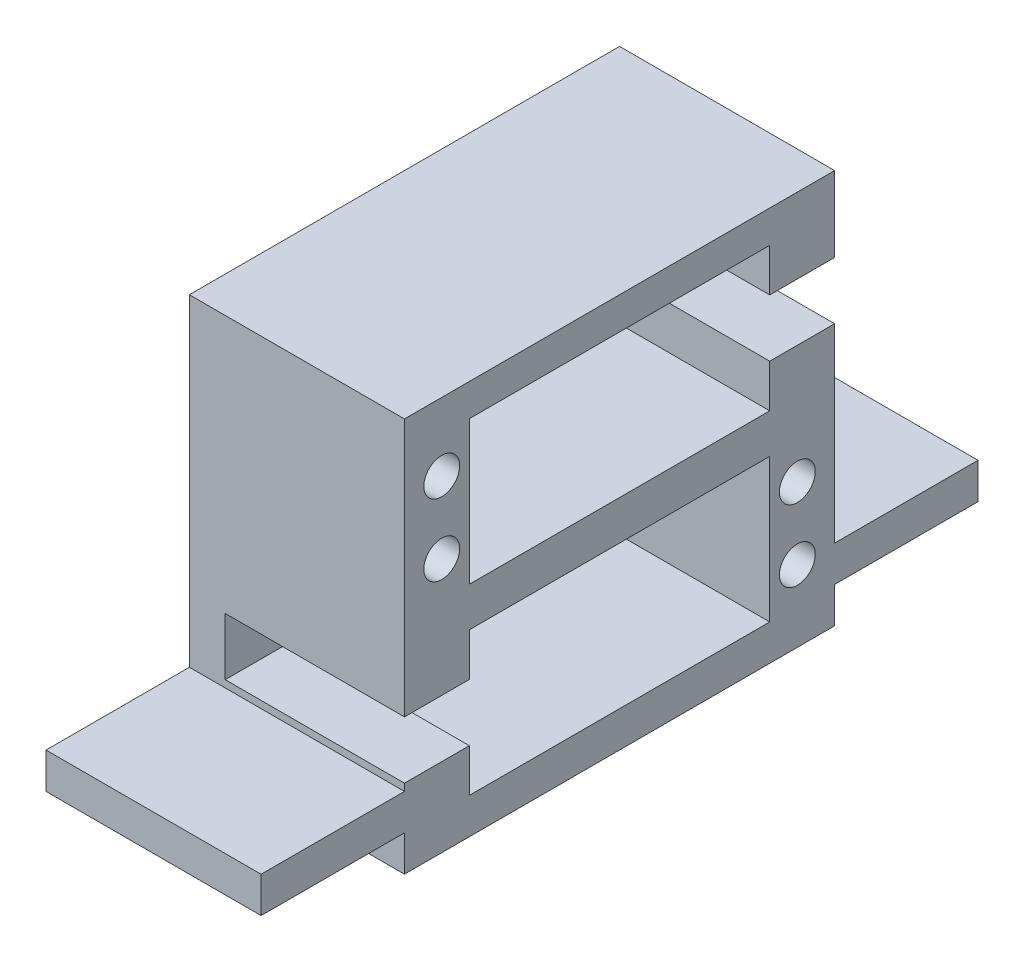
ISO-10303-21;
HEADER;
FILE_DESCRIPTION(('STEP AP214'),'2;1');
FILE_NAME('part.step','',(''),(''),'','','');
FILE_SCHEMA(('AUTOMOTIVE_DESIGN { 1 0 10303 214 1 1 1 1 }'));
ENDSEC;
DATA;
#1=APPLICATION_CONTEXT('core data for automotive mechanical design processes');
#2=APPLICATION_PROTOCOL_DEFINITION('international standard','automotive_design',2000,#1);
#3=PRODUCT_CONTEXT('',#1,'mechanical');
#4=PRODUCT('Part','Part','',(#3));
#5=PRODUCT_RELATED_PRODUCT_CATEGORY('part','',(#4));
#6=PRODUCT_DEFINITION_FORMATION('','',#4);
#7=PRODUCT_DEFINITION_CONTEXT('part definition',#1,'design');
#8=PRODUCT_DEFINITION('design','',#6,#7);
#9=PRODUCT_DEFINITION_SHAPE('','',#8);
#10=(LENGTH_UNIT() NAMED_UNIT(*) SI_UNIT(.MILLI.,.METRE.));
#11=(NAMED_UNIT(*) PLANE_ANGLE_UNIT() SI_UNIT($,.RADIAN.));
#12=(NAMED_UNIT(*) SI_UNIT($,.STERADIAN.) SOLID_ANGLE_UNIT());
#13=UNCERTAINTY_MEASURE_WITH_UNIT(LENGTH_MEASURE(1.E-05),#10,'distance_accuracy_value','');
#14=(GEOMETRIC_REPRESENTATION_CONTEXT(3) GLOBAL_UNCERTAINTY_ASSIGNED_CONTEXT((#13)) GLOBAL_UNIT_ASSIGNED_CONTEXT((#10,
#11,#12)) REPRESENTATION_CONTEXT('',''));
#15=CARTESIAN_POINT('',(0.,0.,0.));
#16=DIRECTION('',(0.,0.,1.));
#17=DIRECTION('',(1.,0.,0.));
#18=AXIS2_PLACEMENT_3D('',#15,#16,#17);
#19=CARTESIAN_POINT('',(-0.874015748031524,55.,22.6377952755906));
#20=DIRECTION('',(0.,0.,-1.));
#21=DIRECTION('',(-1.,0.,0.));
#22=AXIS2_PLACEMENT_3D('',#19,#20,#21);
#23=PLANE('',#22);
#24=DIRECTION('',(0.,-1.,0.));
#25=VECTOR('',#24,1.);
#26=CARTESIAN_POINT('',(-0.874015748031524,55.,22.6377952755906));
#27=LINE('',#26,#25);
#28=CARTESIAN_POINT('',(-0.874015748031524,55.,22.6377952755906));
#29=VERTEX_POINT('',#28);
#30=CARTESIAN_POINT('',(-0.874015748031524,10.,22.6377952755906));
#31=VERTEX_POINT('',#30);
#32=EDGE_CURVE('E54',#29,#31,#27,.T.);
#33=ORIENTED_EDGE('',*,*,#32,.T.);
#34=DIRECTION('',(1.,0.,0.));
#35=VECTOR('',#34,1.);
#36=CARTESIAN_POINT('',(-0.874015748031524,10.,22.6377952755906));
#37=LINE('',#36,#35);
#38=CARTESIAN_POINT('',(29.1259842519685,10.,22.6377952755906));
#39=VERTEX_POINT('',#38);
#40=EDGE_CURVE('E355',#31,#39,#37,.T.);
#41=ORIENTED_EDGE('',*,*,#40,.T.);
#42=DIRECTION('',(0.,-1.,0.));
#43=VECTOR('',#42,1.);
#44=CARTESIAN_POINT('',(29.1259842519685,55.,22.6377952755906));
#45=LINE('',#44,#43);
#46=CARTESIAN_POINT('',(29.1259842519685,11.,22.6377952755906));
#47=VERTEX_POINT('',#46);
#48=EDGE_CURVE('E364',#47,#39,#45,.T.);
#49=ORIENTED_EDGE('',*,*,#48,.F.);
#50=DIRECTION('',(1.,0.,0.));
#51=VECTOR('',#50,1.);
#52=CARTESIAN_POINT('',(4.12598425196847,11.,22.6377952755906));
#53=LINE('',#52,#51);
#54=CARTESIAN_POINT('',(4.12598425196847,11.,22.6377952755906));
#55=VERTEX_POINT('',#54);
#56=EDGE_CURVE('E420',#55,#47,#53,.T.);
#57=ORIENTED_EDGE('',*,*,#56,.F.);
#58=DIRECTION('',(0.,-1.,0.));
#59=VECTOR('',#58,1.);
#60=CARTESIAN_POINT('',(4.12598425196847,19.,22.6377952755906));
#61=LINE('',#60,#59);
#62=CARTESIAN_POINT('',(4.12598425196847,19.,22.6377952755906));
#63=VERTEX_POINT('',#62);
#64=EDGE_CURVE('E408',#63,#55,#61,.T.);
#65=ORIENTED_EDGE('',*,*,#64,.F.);
#66=DIRECTION('',(1.,0.,0.));
#67=VECTOR('',#66,1.);
#68=CARTESIAN_POINT('',(4.12598425196847,19.,22.6377952755906));
#69=LINE('',#68,#67);
#70=CARTESIAN_POINT('',(29.1259842519685,19.,22.6377952755906));
#71=VERTEX_POINT('',#70);
#72=EDGE_CURVE('E421',#63,#71,#69,.T.);
#73=ORIENTED_EDGE('',*,*,#72,.T.);
#74=CARTESIAN_POINT('',(29.1259842519685,55.,22.6377952755906));
#75=VERTEX_POINT('',#74);
#76=EDGE_CURVE('E360',#75,#71,#45,.T.);
#77=ORIENTED_EDGE('',*,*,#76,.F.);
#78=DIRECTION('',(1.,0.,0.));
#79=VECTOR('',#78,1.);
#80=CARTESIAN_POINT('',(-0.874015748031524,55.,22.6377952755906));
#81=LINE('',#80,#79);
#82=EDGE_CURVE('E516',#29,#75,#81,.T.);
#83=ORIENTED_EDGE('',*,*,#82,.F.);
#84=EDGE_LOOP('',(#33,#41,#49,#57,#65,#73,#77,#83));
#85=FACE_BOUND('',#84,.T.);
#86=ADVANCED_FACE('F45',(#85),#23,.F.);
#87=CARTESIAN_POINT('',(-0.874015748031532,55.,-37.3622047244094));
#88=DIRECTION('',(0.,0.,1.));
#89=DIRECTION('',(1.,0.,0.));
#90=AXIS2_PLACEMENT_3D('',#87,#88,#89);
#91=PLANE('',#90);
#92=DIRECTION('',(0.,1.,0.));
#93=VECTOR('',#92,1.);
#94=CARTESIAN_POINT('',(29.1259842519685,55.,-37.3622047244094));
#95=LINE('',#94,#93);
#96=CARTESIAN_POINT('',(29.1259842519685,10.,-37.3622047244094));
#97=VERTEX_POINT('',#96);
#98=CARTESIAN_POINT('',(29.1259842519685,36.5,-37.3622047244094));
#99=VERTEX_POINT('',#98);
#100=EDGE_CURVE('E372',#97,#99,#95,.T.);
#101=ORIENTED_EDGE('',*,*,#100,.F.);
#102=DIRECTION('',(-1.,0.,0.));
#103=VECTOR('',#102,1.);
#104=CARTESIAN_POINT('',(-0.874015748031532,10.,-37.3622047244094));
#105=LINE('',#104,#103);
#106=CARTESIAN_POINT('',(-0.874015748031524,10.,-37.3622047244094));
#107=VERTEX_POINT('',#106);
#108=EDGE_CURVE('E351',#97,#107,#105,.T.);
#109=ORIENTED_EDGE('',*,*,#108,.T.);
#110=DIRECTION('',(0.,-1.,0.));
#111=VECTOR('',#110,1.);
#112=CARTESIAN_POINT('',(-0.874015748031532,55.,-37.3622047244094));
#113=LINE('',#112,#111);
#114=CARTESIAN_POINT('',(-0.874015748031532,55.,-37.3622047244094));
#115=VERTEX_POINT('',#114);
#116=EDGE_CURVE('E535',#115,#107,#113,.T.);
#117=ORIENTED_EDGE('',*,*,#116,.F.);
#118=DIRECTION('',(-1.,0.,0.));
#119=VECTOR('',#118,1.);
#120=CARTESIAN_POINT('',(-0.874015748031532,55.,-37.3622047244094));
#121=LINE('',#120,#119);
#122=CARTESIAN_POINT('',(29.1259842519685,55.,-37.3622047244094));
#123=VERTEX_POINT('',#122);
#124=EDGE_CURVE('E521',#123,#115,#121,.T.);
#125=ORIENTED_EDGE('',*,*,#124,.F.);
#126=CARTESIAN_POINT('',(29.1259842519685,44.5,-37.3622047244094));
#127=VERTEX_POINT('',#126);
#128=EDGE_CURVE('E367',#127,#123,#95,.T.);
#129=ORIENTED_EDGE('',*,*,#128,.F.);
#130=DIRECTION('',(1.,0.,0.));
#131=VECTOR('',#130,1.);
#132=CARTESIAN_POINT('',(4.12598425196847,44.5,-37.3622047244094));
#133=LINE('',#132,#131);
#134=CARTESIAN_POINT('',(4.12598425196847,44.5,-37.3622047244094));
#135=VERTEX_POINT('',#134);
#136=EDGE_CURVE('E444',#135,#127,#133,.T.);
#137=ORIENTED_EDGE('',*,*,#136,.F.);
#138=DIRECTION('',(0.,1.,0.));
#139=VECTOR('',#138,1.);
#140=CARTESIAN_POINT('',(4.12598425196847,44.5,-37.3622047244094));
#141=LINE('',#140,#139);
#142=CARTESIAN_POINT('',(4.12598425196847,36.5,-37.3622047244094));
#143=VERTEX_POINT('',#142);
#144=EDGE_CURVE('E453',#143,#135,#141,.T.);
#145=ORIENTED_EDGE('',*,*,#144,.F.);
#146=DIRECTION('',(1.,0.,0.));
#147=VECTOR('',#146,1.);
#148=CARTESIAN_POINT('',(4.12598425196847,36.5,-37.3622047244094));
#149=LINE('',#148,#147);
#150=EDGE_CURVE('E440',#143,#99,#149,.T.);
#151=ORIENTED_EDGE('',*,*,#150,.T.);
#152=EDGE_LOOP('',(#101,#109,#117,#125,#129,#137,#145,#151));
#153=FACE_BOUND('',#152,.T.);
#154=ADVANCED_FACE('F602',(#153),#91,.F.);
#155=CARTESIAN_POINT('',(4.12598425196847,25.,13.5877952755906));
#156=DIRECTION('',(0.,0.,1.));
#157=DIRECTION('',(0.,-1.,0.));
#158=AXIS2_PLACEMENT_3D('',#155,#156,#157);
#159=PLANE('',#158);
#160=DIRECTION('',(0.,1.,0.));
#161=VECTOR('',#160,1.);
#162=CARTESIAN_POINT('',(29.1259842519685,25.,13.5877952755906));
#163=LINE('',#162,#161);
#164=CARTESIAN_POINT('',(29.1259842519685,19.,13.5877952755906));
#165=VERTEX_POINT('',#164);
#166=CARTESIAN_POINT('',(29.1259842519685,25.,13.5877952755906));
#167=VERTEX_POINT('',#166);
#168=EDGE_CURVE('E380',#165,#167,#163,.T.);
#169=ORIENTED_EDGE('',*,*,#168,.F.);
#170=DIRECTION('',(1.,0.,0.));
#171=VECTOR('',#170,1.);
#172=CARTESIAN_POINT('',(4.12598425196847,19.,13.5877952755906));
#173=LINE('',#172,#171);
#174=CARTESIAN_POINT('',(4.12598425196847,19.,13.5877952755906));
#175=VERTEX_POINT('',#174);
#176=EDGE_CURVE('E426',#175,#165,#173,.T.);
#177=ORIENTED_EDGE('',*,*,#176,.F.);
#178=DIRECTION('',(0.,-1.,0.));
#179=VECTOR('',#178,1.);
#180=CARTESIAN_POINT('',(4.12598425196847,25.,13.5877952755906));
#181=LINE('',#180,#179);
#182=CARTESIAN_POINT('',(4.12598425196847,25.,13.5877952755906));
#183=VERTEX_POINT('',#182);
#184=EDGE_CURVE('E464',#183,#175,#181,.T.);
#185=ORIENTED_EDGE('',*,*,#184,.F.);
#186=DIRECTION('',(1.,0.,0.));
#187=VECTOR('',#186,1.);
#188=CARTESIAN_POINT('',(4.12598425196847,25.,13.5877952755906));
#189=LINE('',#188,#187);
#190=EDGE_CURVE('E425',#183,#167,#189,.T.);
#191=ORIENTED_EDGE('',*,*,#190,.T.);
#192=EDGE_LOOP('',(#169,#177,#185,#191));
#193=FACE_BOUND('',#192,.T.);
#194=ADVANCED_FACE('F581',(#193),#159,.F.);
#195=CARTESIAN_POINT('',(4.12598425196847,50.5,-28.3122047244094));
#196=DIRECTION('',(0.,0.,-1.));
#197=DIRECTION('',(-1.,0.,0.));
#198=AXIS2_PLACEMENT_3D('',#195,#196,#197);
#199=PLANE('',#198);
#200=DIRECTION('',(0.,-1.,0.));
#201=VECTOR('',#200,1.);
#202=CARTESIAN_POINT('',(29.1259842519685,50.5,-28.3122047244094));
#203=LINE('',#202,#201);
#204=CARTESIAN_POINT('',(29.1259842519685,50.5,-28.3122047244094));
#205=VERTEX_POINT('',#204);
#206=CARTESIAN_POINT('',(29.1259842519685,44.5,-28.3122047244094));
#207=VERTEX_POINT('',#206);
#208=EDGE_CURVE('E401',#205,#207,#203,.T.);
#209=ORIENTED_EDGE('',*,*,#208,.F.);
#210=DIRECTION('',(1.,0.,0.));
#211=VECTOR('',#210,1.);
#212=CARTESIAN_POINT('',(4.12598425196847,50.5,-28.3122047244094));
#213=LINE('',#212,#211);
#214=CARTESIAN_POINT('',(4.12598425196847,50.5,-28.3122047244094));
#215=VERTEX_POINT('',#214);
#216=EDGE_CURVE('E483',#215,#205,#213,.T.);
#217=ORIENTED_EDGE('',*,*,#216,.F.);
#218=DIRECTION('',(0.,1.,0.));
#219=VECTOR('',#218,1.);
#220=CARTESIAN_POINT('',(4.12598425196847,50.5,-28.3122047244094));
#221=LINE('',#220,#219);
#222=CARTESIAN_POINT('',(4.12598425196847,44.5,-28.3122047244094));
#223=VERTEX_POINT('',#222);
#224=EDGE_CURVE('E468',#223,#215,#221,.T.);
#225=ORIENTED_EDGE('',*,*,#224,.F.);
#226=DIRECTION('',(1.,0.,0.));
#227=VECTOR('',#226,1.);
#228=CARTESIAN_POINT('',(4.12598425196847,44.5,-28.3122047244094));
#229=LINE('',#228,#227);
#230=EDGE_CURVE('E407',#223,#207,#229,.T.);
#231=ORIENTED_EDGE('',*,*,#230,.T.);
#232=EDGE_LOOP('',(#209,#217,#225,#231));
#233=FACE_BOUND('',#232,.T.);
#234=ADVANCED_FACE('F634',(#233),#199,.F.);
#235=CARTESIAN_POINT('',(29.1259842519685,5.,22.6377952755906));
#236=VERTEX_POINT('',#235);
#237=CARTESIAN_POINT('',(29.1259842519685,0.,22.6377952755906));
#238=VERTEX_POINT('',#237);
#239=EDGE_CURVE('E359',#236,#238,#45,.T.);
#240=ORIENTED_EDGE('',*,*,#239,.F.);
#241=DIRECTION('',(-1.,0.,0.));
#242=VECTOR('',#241,1.);
#243=CARTESIAN_POINT('',(-0.874015748031523,5.,22.6377952755906));
#244=LINE('',#243,#242);
#245=CARTESIAN_POINT('',(-0.874015748031524,5.,22.6377952755906));
#246=VERTEX_POINT('',#245);
#247=EDGE_CURVE('E348',#236,#246,#244,.T.);
#248=ORIENTED_EDGE('',*,*,#247,.T.);
#249=CARTESIAN_POINT('',(-0.874015748031524,0.,22.6377952755906));
#250=VERTEX_POINT('',#249);
#251=EDGE_CURVE('E538',#246,#250,#27,.T.);
#252=ORIENTED_EDGE('',*,*,#251,.T.);
#253=DIRECTION('',(1.,0.,0.));
#254=VECTOR('',#253,1.);
#255=CARTESIAN_POINT('',(-0.874015748031524,0.,22.6377952755906));
#256=LINE('',#255,#254);
#257=EDGE_CURVE('E528',#250,#238,#256,.T.);
#258=ORIENTED_EDGE('',*,*,#257,.T.);
#259=EDGE_LOOP('',(#240,#248,#252,#258));
#260=FACE_BOUND('',#259,.T.);
#261=ADVANCED_FACE('F548',(#260),#23,.F.);
#262=CARTESIAN_POINT('',(-0.874015748031524,5.,-37.3622047244094));
#263=VERTEX_POINT('',#262);
#264=CARTESIAN_POINT('',(-0.874015748031532,0.,-37.3622047244094));
#265=VERTEX_POINT('',#264);
#266=EDGE_CURVE('E524',#263,#265,#113,.T.);
#267=ORIENTED_EDGE('',*,*,#266,.F.);
#268=DIRECTION('',(1.,0.,0.));
#269=VECTOR('',#268,1.);
#270=CARTESIAN_POINT('',(-0.87401574803153,5.,-37.3622047244094));
#271=LINE('',#270,#269);
#272=CARTESIAN_POINT('',(29.1259842519685,5.,-37.3622047244094));
#273=VERTEX_POINT('',#272);
#274=EDGE_CURVE('E332',#263,#273,#271,.T.);
#275=ORIENTED_EDGE('',*,*,#274,.T.);
#276=CARTESIAN_POINT('',(29.1259842519685,0.,-37.3622047244094));
#277=VERTEX_POINT('',#276);
#278=EDGE_CURVE('E368',#277,#273,#95,.T.);
#279=ORIENTED_EDGE('',*,*,#278,.F.);
#280=DIRECTION('',(-1.,0.,0.));
#281=VECTOR('',#280,1.);
#282=CARTESIAN_POINT('',(-0.874015748031532,0.,-37.3622047244094));
#283=LINE('',#282,#281);
#284=EDGE_CURVE('E517',#277,#265,#283,.T.);
#285=ORIENTED_EDGE('',*,*,#284,.T.);
#286=EDGE_LOOP('',(#267,#275,#279,#285));
#287=FACE_BOUND('',#286,.T.);
#288=ADVANCED_FACE('F559',(#287),#91,.F.);
#289=CARTESIAN_POINT('',(0.,55.,0.));
#290=DIRECTION('',(0.,1.,0.));
#291=DIRECTION('',(0.,0.,1.));
#292=AXIS2_PLACEMENT_3D('',#289,#290,#291);
#293=PLANE('',#292);
#294=ORIENTED_EDGE('',*,*,#82,.T.);
#295=DIRECTION('',(0.,0.,1.));
#296=VECTOR('',#295,1.);
#297=CARTESIAN_POINT('',(29.1259842519685,55.,22.6377952755906));
#298=LINE('',#297,#296);
#299=EDGE_CURVE('E242',#123,#75,#298,.T.);
#300=ORIENTED_EDGE('',*,*,#299,.F.);
#301=ORIENTED_EDGE('',*,*,#124,.T.);
#302=DIRECTION('',(0.,0.,1.));
#303=VECTOR('',#302,1.);
#304=CARTESIAN_POINT('',(-0.874015748031532,55.,-37.3622047244094));
#305=LINE('',#304,#303);
#306=EDGE_CURVE('E512',#115,#29,#305,.T.);
#307=ORIENTED_EDGE('',*,*,#306,.T.);
#308=EDGE_LOOP('',(#294,#300,#301,#307));
#309=FACE_BOUND('',#308,.T.);
#310=ADVANCED_FACE('F599',(#309),#293,.T.);
#311=CARTESIAN_POINT('',(0.,0.,0.));
#312=DIRECTION('',(0.,1.,0.));
#313=DIRECTION('',(0.,0.,1.));
#314=AXIS2_PLACEMENT_3D('',#311,#312,#313);
#315=PLANE('',#314);
#316=DIRECTION('',(0.,0.,-1.));
#317=VECTOR('',#316,1.);
#318=CARTESIAN_POINT('',(29.1259842519685,0.,22.6377952755906));
#319=LINE('',#318,#317);
#320=EDGE_CURVE('E363',#238,#277,#319,.T.);
#321=ORIENTED_EDGE('',*,*,#320,.F.);
#322=ORIENTED_EDGE('',*,*,#257,.F.);
#323=DIRECTION('',(0.,0.,1.));
#324=VECTOR('',#323,1.);
#325=CARTESIAN_POINT('',(-0.874015748031532,0.,-37.3622047244094));
#326=LINE('',#325,#324);
#327=EDGE_CURVE('E482',#265,#250,#326,.T.);
#328=ORIENTED_EDGE('',*,*,#327,.F.);
#329=ORIENTED_EDGE('',*,*,#284,.F.);
#330=EDGE_LOOP('',(#321,#322,#328,#329));
#331=FACE_BOUND('',#330,.T.);
#332=ADVANCED_FACE('F553',(#331),#315,.F.);
#333=DIRECTION('',(0.,1.,0.));
#334=VECTOR('',#333,1.);
#335=CARTESIAN_POINT('',(29.1259842519685,25.,13.5877952755906));
#336=LINE('',#335,#334);
#337=CARTESIAN_POINT('',(29.1259842519685,5.,13.5877952755906));
#338=VERTEX_POINT('',#337);
#339=CARTESIAN_POINT('',(29.1259842519685,11.,13.5877952755906));
#340=VERTEX_POINT('',#339);
#341=EDGE_CURVE('E230',#338,#340,#336,.T.);
#342=ORIENTED_EDGE('',*,*,#341,.F.);
#343=DIRECTION('',(1.,0.,0.));
#344=VECTOR('',#343,1.);
#345=CARTESIAN_POINT('',(-38.0712905415534,5.,13.5877952755906));
#346=LINE('',#345,#344);
#347=CARTESIAN_POINT('',(4.12598425196847,5.,13.5877952755906));
#348=VERTEX_POINT('',#347);
#349=EDGE_CURVE('E234',#348,#338,#346,.T.);
#350=ORIENTED_EDGE('',*,*,#349,.F.);
#351=CARTESIAN_POINT('',(4.12598425196847,11.,13.5877952755906));
#352=VERTEX_POINT('',#351);
#353=EDGE_CURVE('E508',#352,#348,#181,.T.);
#354=ORIENTED_EDGE('',*,*,#353,.F.);
#355=DIRECTION('',(1.,0.,0.));
#356=VECTOR('',#355,1.);
#357=CARTESIAN_POINT('',(4.12598425196847,11.,13.5877952755906));
#358=LINE('',#357,#356);
#359=EDGE_CURVE('E236',#352,#340,#358,.T.);
#360=ORIENTED_EDGE('',*,*,#359,.T.);
#361=EDGE_LOOP('',(#342,#350,#354,#360));
#362=FACE_BOUND('',#361,.T.);
#363=ADVANCED_FACE('F232',(#362),#159,.F.);
#364=CARTESIAN_POINT('',(4.12598425196847,25.,13.5877952755906));
#365=DIRECTION('',(0.,1.,0.));
#366=DIRECTION('',(0.,0.,1.));
#367=AXIS2_PLACEMENT_3D('',#364,#365,#366);
#368=PLANE('',#367);
#369=DIRECTION('',(0.,0.,-1.));
#370=VECTOR('',#369,1.);
#371=CARTESIAN_POINT('',(29.1259842519685,25.,13.5877952755906));
#372=LINE('',#371,#370);
#373=CARTESIAN_POINT('',(29.1259842519685,25.,-28.3122047244094));
#374=VERTEX_POINT('',#373);
#375=EDGE_CURVE('E377',#167,#374,#372,.T.);
#376=ORIENTED_EDGE('',*,*,#375,.F.);
#377=ORIENTED_EDGE('',*,*,#190,.F.);
#378=DIRECTION('',(0.,0.,1.));
#379=VECTOR('',#378,1.);
#380=CARTESIAN_POINT('',(4.12598425196847,25.,13.5877952755906));
#381=LINE('',#380,#379);
#382=CARTESIAN_POINT('',(4.12598425196847,25.,-28.3122047244094));
#383=VERTEX_POINT('',#382);
#384=EDGE_CURVE('E498',#383,#183,#381,.T.);
#385=ORIENTED_EDGE('',*,*,#384,.F.);
#386=DIRECTION('',(1.,0.,0.));
#387=VECTOR('',#386,1.);
#388=CARTESIAN_POINT('',(4.12598425196847,25.,-28.3122047244094));
#389=LINE('',#388,#387);
#390=EDGE_CURVE('E494',#383,#374,#389,.T.);
#391=ORIENTED_EDGE('',*,*,#390,.T.);
#392=EDGE_LOOP('',(#376,#377,#385,#391));
#393=FACE_BOUND('',#392,.T.);
#394=ADVANCED_FACE('F585',(#393),#368,.F.);
#395=CARTESIAN_POINT('',(4.12598425196847,25.,-28.3122047244094));
#396=DIRECTION('',(0.,0.,-1.));
#397=DIRECTION('',(-1.,0.,0.));
#398=AXIS2_PLACEMENT_3D('',#395,#396,#397);
#399=PLANE('',#398);
#400=DIRECTION('',(0.,1.,0.));
#401=VECTOR('',#400,1.);
#402=CARTESIAN_POINT('',(4.12598425196847,25.,-28.3122047244094));
#403=LINE('',#402,#401);
#404=CARTESIAN_POINT('',(4.12598425196847,5.,-28.3122047244094));
#405=VERTEX_POINT('',#404);
#406=EDGE_CURVE('E505',#405,#383,#403,.T.);
#407=ORIENTED_EDGE('',*,*,#406,.F.);
#408=DIRECTION('',(1.,0.,0.));
#409=VECTOR('',#408,1.);
#410=CARTESIAN_POINT('',(-38.0712905415534,5.,-28.3122047244094));
#411=LINE('',#410,#409);
#412=CARTESIAN_POINT('',(29.1259842519685,5.,-28.3122047244094));
#413=VERTEX_POINT('',#412);
#414=EDGE_CURVE('E253',#405,#413,#411,.T.);
#415=ORIENTED_EDGE('',*,*,#414,.T.);
#416=DIRECTION('',(0.,-1.,0.));
#417=VECTOR('',#416,1.);
#418=CARTESIAN_POINT('',(29.1259842519685,25.,-28.3122047244094));
#419=LINE('',#418,#417);
#420=EDGE_CURVE('E241',#374,#413,#419,.T.);
#421=ORIENTED_EDGE('',*,*,#420,.F.);
#422=ORIENTED_EDGE('',*,*,#390,.F.);
#423=EDGE_LOOP('',(#407,#415,#421,#422));
#424=FACE_BOUND('',#423,.T.);
#425=ADVANCED_FACE('F588',(#424),#399,.F.);
#426=CARTESIAN_POINT('',(4.12598425196847,50.5,13.5877952755906));
#427=DIRECTION('',(0.,0.,1.));
#428=DIRECTION('',(0.,-1.,0.));
#429=AXIS2_PLACEMENT_3D('',#426,#427,#428);
#430=PLANE('',#429);
#431=DIRECTION('',(0.,1.,0.));
#432=VECTOR('',#431,1.);
#433=CARTESIAN_POINT('',(29.1259842519685,50.5,13.5877952755906));
#434=LINE('',#433,#432);
#435=CARTESIAN_POINT('',(29.1259842519685,30.5,13.5877952755906));
#436=VERTEX_POINT('',#435);
#437=CARTESIAN_POINT('',(29.1259842519685,50.5,13.5877952755906));
#438=VERTEX_POINT('',#437);
#439=EDGE_CURVE('E395',#436,#438,#434,.T.);
#440=ORIENTED_EDGE('',*,*,#439,.F.);
#441=DIRECTION('',(1.,0.,0.));
#442=VECTOR('',#441,1.);
#443=CARTESIAN_POINT('',(4.12598425196847,30.5,13.5877952755906));
#444=LINE('',#443,#442);
#445=CARTESIAN_POINT('',(4.12598425196847,30.5,13.5877952755906));
#446=VERTEX_POINT('',#445);
#447=EDGE_CURVE('E477',#446,#436,#444,.T.);
#448=ORIENTED_EDGE('',*,*,#447,.F.);
#449=DIRECTION('',(0.,-1.,0.));
#450=VECTOR('',#449,1.);
#451=CARTESIAN_POINT('',(4.12598425196847,50.5,13.5877952755906));
#452=LINE('',#451,#450);
#453=CARTESIAN_POINT('',(4.12598425196847,50.5,13.5877952755906));
#454=VERTEX_POINT('',#453);
#455=EDGE_CURVE('E459',#454,#446,#452,.T.);
#456=ORIENTED_EDGE('',*,*,#455,.F.);
#457=DIRECTION('',(1.,0.,0.));
#458=VECTOR('',#457,1.);
#459=CARTESIAN_POINT('',(4.12598425196847,50.5,13.5877952755906));
#460=LINE('',#459,#458);
#461=EDGE_CURVE('E478',#454,#438,#460,.T.);
#462=ORIENTED_EDGE('',*,*,#461,.T.);
#463=EDGE_LOOP('',(#440,#448,#456,#462));
#464=FACE_BOUND('',#463,.T.);
#465=ADVANCED_FACE('F660',(#464),#430,.F.);
#466=CARTESIAN_POINT('',(4.12598425196847,50.5,13.5877952755906));
#467=DIRECTION('',(0.,1.,0.));
#468=DIRECTION('',(0.,0.,1.));
#469=AXIS2_PLACEMENT_3D('',#466,#467,#468);
#470=PLANE('',#469);
#471=DIRECTION('',(0.,0.,-1.));
#472=VECTOR('',#471,1.);
#473=CARTESIAN_POINT('',(29.1259842519685,50.5,13.5877952755906));
#474=LINE('',#473,#472);
#475=EDGE_CURVE('E398',#438,#205,#474,.T.);
#476=ORIENTED_EDGE('',*,*,#475,.F.);
#477=ORIENTED_EDGE('',*,*,#461,.F.);
#478=DIRECTION('',(0.,0.,1.));
#479=VECTOR('',#478,1.);
#480=CARTESIAN_POINT('',(4.12598425196847,50.5,13.5877952755906));
#481=LINE('',#480,#479);
#482=EDGE_CURVE('E473',#215,#454,#481,.T.);
#483=ORIENTED_EDGE('',*,*,#482,.F.);
#484=ORIENTED_EDGE('',*,*,#216,.T.);
#485=EDGE_LOOP('',(#476,#477,#483,#484));
#486=FACE_BOUND('',#485,.T.);
#487=ADVANCED_FACE('F652',(#486),#470,.F.);
#488=DIRECTION('',(0.,-1.,0.));
#489=VECTOR('',#488,1.);
#490=CARTESIAN_POINT('',(29.1259842519685,50.5,-28.3122047244094));
#491=LINE('',#490,#489);
#492=CARTESIAN_POINT('',(29.1259842519685,36.5,-28.3122047244094));
#493=VERTEX_POINT('',#492);
#494=CARTESIAN_POINT('',(29.1259842519685,30.5,-28.3122047244094));
#495=VERTEX_POINT('',#494);
#496=EDGE_CURVE('E389',#493,#495,#491,.T.);
#497=ORIENTED_EDGE('',*,*,#496,.F.);
#498=DIRECTION('',(1.,0.,0.));
#499=VECTOR('',#498,1.);
#500=CARTESIAN_POINT('',(4.12598425196847,36.5,-28.3122047244094));
#501=LINE('',#500,#499);
#502=CARTESIAN_POINT('',(4.12598425196847,36.5,-28.3122047244094));
#503=VERTEX_POINT('',#502);
#504=EDGE_CURVE('E435',#503,#493,#501,.T.);
#505=ORIENTED_EDGE('',*,*,#504,.F.);
#506=CARTESIAN_POINT('',(4.12598425196847,30.5,-28.3122047244094));
#507=VERTEX_POINT('',#506);
#508=EDGE_CURVE('E469',#507,#503,#221,.T.);
#509=ORIENTED_EDGE('',*,*,#508,.F.);
#510=DIRECTION('',(1.,0.,0.));
#511=VECTOR('',#510,1.);
#512=CARTESIAN_POINT('',(4.12598425196847,30.5,-28.3122047244094));
#513=LINE('',#512,#511);
#514=EDGE_CURVE('E487',#507,#495,#513,.T.);
#515=ORIENTED_EDGE('',*,*,#514,.T.);
#516=EDGE_LOOP('',(#497,#505,#509,#515));
#517=FACE_BOUND('',#516,.T.);
#518=ADVANCED_FACE('F641',(#517),#199,.F.);
#519=CARTESIAN_POINT('',(4.12598425196847,30.5,13.5877952755906));
#520=DIRECTION('',(0.,-1.,0.));
#521=DIRECTION('',(0.,0.,-1.));
#522=AXIS2_PLACEMENT_3D('',#519,#520,#521);
#523=PLANE('',#522);
#524=DIRECTION('',(0.,0.,1.));
#525=VECTOR('',#524,1.);
#526=CARTESIAN_POINT('',(29.1259842519685,30.5,13.5877952755906));
#527=LINE('',#526,#525);
#528=EDGE_CURVE('E392',#495,#436,#527,.T.);
#529=ORIENTED_EDGE('',*,*,#528,.F.);
#530=ORIENTED_EDGE('',*,*,#514,.F.);
#531=DIRECTION('',(0.,0.,-1.));
#532=VECTOR('',#531,1.);
#533=CARTESIAN_POINT('',(4.12598425196847,30.5,13.5877952755906));
#534=LINE('',#533,#532);
#535=EDGE_CURVE('E463',#446,#507,#534,.T.);
#536=ORIENTED_EDGE('',*,*,#535,.F.);
#537=ORIENTED_EDGE('',*,*,#447,.T.);
#538=EDGE_LOOP('',(#529,#530,#536,#537));
#539=FACE_BOUND('',#538,.T.);
#540=ADVANCED_FACE('F651',(#539),#523,.F.);
#541=CARTESIAN_POINT('',(4.12598425196847,44.5,-28.3122047244094));
#542=DIRECTION('',(0.,1.,0.));
#543=DIRECTION('',(0.,0.,1.));
#544=AXIS2_PLACEMENT_3D('',#541,#542,#543);
#545=PLANE('',#544);
#546=DIRECTION('',(0.,0.,-1.));
#547=VECTOR('',#546,1.);
#548=CARTESIAN_POINT('',(29.1259842519685,44.5,-28.3122047244094));
#549=LINE('',#548,#547);
#550=EDGE_CURVE('E404',#207,#127,#549,.T.);
#551=ORIENTED_EDGE('',*,*,#550,.F.);
#552=ORIENTED_EDGE('',*,*,#230,.F.);
#553=DIRECTION('',(0.,0.,1.));
#554=VECTOR('',#553,1.);
#555=CARTESIAN_POINT('',(4.12598425196847,44.5,-28.3122047244094));
#556=LINE('',#555,#554);
#557=EDGE_CURVE('E439',#135,#223,#556,.T.);
#558=ORIENTED_EDGE('',*,*,#557,.F.);
#559=ORIENTED_EDGE('',*,*,#136,.T.);
#560=EDGE_LOOP('',(#551,#552,#558,#559));
#561=FACE_BOUND('',#560,.T.);
#562=ADVANCED_FACE('F658',(#561),#545,.F.);
#563=CARTESIAN_POINT('',(4.12598425196847,36.5,-28.3122047244094));
#564=DIRECTION('',(0.,-1.,0.));
#565=DIRECTION('',(0.,0.,-1.));
#566=AXIS2_PLACEMENT_3D('',#563,#564,#565);
#567=PLANE('',#566);
#568=DIRECTION('',(0.,0.,1.));
#569=VECTOR('',#568,1.);
#570=CARTESIAN_POINT('',(29.1259842519685,36.5,-28.3122047244094));
#571=LINE('',#570,#569);
#572=EDGE_CURVE('E386',#99,#493,#571,.T.);
#573=ORIENTED_EDGE('',*,*,#572,.F.);
#574=ORIENTED_EDGE('',*,*,#150,.F.);
#575=DIRECTION('',(0.,0.,-1.));
#576=VECTOR('',#575,1.);
#577=CARTESIAN_POINT('',(4.12598425196847,36.5,-28.3122047244094));
#578=LINE('',#577,#576);
#579=EDGE_CURVE('E413',#503,#143,#578,.T.);
#580=ORIENTED_EDGE('',*,*,#579,.F.);
#581=ORIENTED_EDGE('',*,*,#504,.T.);
#582=EDGE_LOOP('',(#573,#574,#580,#581));
#583=FACE_BOUND('',#582,.T.);
#584=ADVANCED_FACE('F668',(#583),#567,.F.);
#585=CARTESIAN_POINT('',(4.12598425196847,19.,22.6377952755906));
#586=DIRECTION('',(0.,1.,0.));
#587=DIRECTION('',(0.,0.,1.));
#588=AXIS2_PLACEMENT_3D('',#585,#586,#587);
#589=PLANE('',#588);
#590=DIRECTION('',(0.,0.,-1.));
#591=VECTOR('',#590,1.);
#592=CARTESIAN_POINT('',(29.1259842519685,19.,22.6377952755906));
#593=LINE('',#592,#591);
#594=EDGE_CURVE('E383',#71,#165,#593,.T.);
#595=ORIENTED_EDGE('',*,*,#594,.F.);
#596=ORIENTED_EDGE('',*,*,#72,.F.);
#597=DIRECTION('',(0.,0.,1.));
#598=VECTOR('',#597,1.);
#599=CARTESIAN_POINT('',(4.12598425196847,19.,22.6377952755906));
#600=LINE('',#599,#598);
#601=EDGE_CURVE('E416',#175,#63,#600,.T.);
#602=ORIENTED_EDGE('',*,*,#601,.F.);
#603=ORIENTED_EDGE('',*,*,#176,.T.);
#604=EDGE_LOOP('',(#595,#596,#602,#603));
#605=FACE_BOUND('',#604,.T.);
#606=ADVANCED_FACE('F576',(#605),#589,.F.);
#607=CARTESIAN_POINT('',(4.12598425196847,11.,22.6377952755906));
#608=DIRECTION('',(0.,-1.,0.));
#609=DIRECTION('',(0.,0.,-1.));
#610=AXIS2_PLACEMENT_3D('',#607,#608,#609);
#611=PLANE('',#610);
#612=DIRECTION('',(0.,0.,1.));
#613=VECTOR('',#612,1.);
#614=CARTESIAN_POINT('',(29.1259842519685,11.,22.6377952755906));
#615=LINE('',#614,#613);
#616=EDGE_CURVE('E11',#340,#47,#615,.T.);
#617=ORIENTED_EDGE('',*,*,#616,.F.);
#618=ORIENTED_EDGE('',*,*,#359,.F.);
#619=DIRECTION('',(0.,0.,-1.));
#620=VECTOR('',#619,1.);
#621=CARTESIAN_POINT('',(4.12598425196847,11.,22.6377952755906));
#622=LINE('',#621,#620);
#623=EDGE_CURVE('E412',#55,#352,#622,.T.);
#624=ORIENTED_EDGE('',*,*,#623,.F.);
#625=ORIENTED_EDGE('',*,*,#56,.T.);
#626=EDGE_LOOP('',(#617,#618,#624,#625));
#627=FACE_BOUND('',#626,.T.);
#628=ADVANCED_FACE('F570',(#627),#611,.F.);
#629=CARTESIAN_POINT('',(-0.874015748031532,55.,-37.3622047244094));
#630=DIRECTION('',(1.,0.,0.));
#631=DIRECTION('',(0.,0.,-1.));
#632=AXIS2_PLACEMENT_3D('',#629,#630,#631);
#633=PLANE('',#632);
#634=ORIENTED_EDGE('',*,*,#251,.F.);
#635=DIRECTION('',(0.,0.,1.));
#636=VECTOR('',#635,1.);
#637=CARTESIAN_POINT('',(-0.874015748031524,5.,-57.3622047244094));
#638=LINE('',#637,#636);
#639=CARTESIAN_POINT('',(-0.874015748031524,5.,42.6377952755906));
#640=VERTEX_POINT('',#639);
#641=EDGE_CURVE('E61',#246,#640,#638,.T.);
#642=ORIENTED_EDGE('',*,*,#641,.T.);
#643=DIRECTION('',(0.,-1.,0.));
#644=VECTOR('',#643,1.);
#645=CARTESIAN_POINT('',(-0.874015748031524,10.,42.6377952755906));
#646=LINE('',#645,#644);
#647=CARTESIAN_POINT('',(-0.874015748031524,10.,42.6377952755906));
#648=VERTEX_POINT('',#647);
#649=EDGE_CURVE('E287',#648,#640,#646,.T.);
#650=ORIENTED_EDGE('',*,*,#649,.F.);
#651=DIRECTION('',(0.,0.,1.));
#652=VECTOR('',#651,1.);
#653=CARTESIAN_POINT('',(-0.874015748031524,10.,-57.3622047244094));
#654=LINE('',#653,#652);
#655=EDGE_CURVE('E333',#31,#648,#654,.T.);
#656=ORIENTED_EDGE('',*,*,#655,.F.);
#657=ORIENTED_EDGE('',*,*,#32,.F.);
#658=ORIENTED_EDGE('',*,*,#306,.F.);
#659=ORIENTED_EDGE('',*,*,#116,.T.);
#660=CARTESIAN_POINT('',(-0.874015748031524,10.,-57.3622047244094));
#661=VERTEX_POINT('',#660);
#662=EDGE_CURVE('E329',#661,#107,#654,.T.);
#663=ORIENTED_EDGE('',*,*,#662,.F.);
#664=DIRECTION('',(0.,-1.,0.));
#665=VECTOR('',#664,1.);
#666=CARTESIAN_POINT('',(-0.874015748031524,10.,-57.3622047244094));
#667=LINE('',#666,#665);
#668=CARTESIAN_POINT('',(-0.874015748031524,5.,-57.3622047244094));
#669=VERTEX_POINT('',#668);
#670=EDGE_CURVE('E314',#661,#669,#667,.T.);
#671=ORIENTED_EDGE('',*,*,#670,.T.);
#672=EDGE_CURVE('E342',#669,#263,#638,.T.);
#673=ORIENTED_EDGE('',*,*,#672,.T.);
#674=ORIENTED_EDGE('',*,*,#266,.T.);
#675=ORIENTED_EDGE('',*,*,#327,.T.);
#676=EDGE_LOOP('',(#634,#642,#650,#656,#657,#658,#659,#663,#671,#673,#674,#675));
#677=FACE_BOUND('',#676,.T.);
#678=ADVANCED_FACE('F47',(#677),#633,.F.);
#679=CARTESIAN_POINT('',(4.12598425196847,0.,0.));
#680=DIRECTION('',(1.,0.,0.));
#681=DIRECTION('',(0.,0.,-1.));
#682=AXIS2_PLACEMENT_3D('',#679,#680,#681);
#683=PLANE('',#682);
#684=ORIENTED_EDGE('',*,*,#353,.T.);
#685=DIRECTION('',(0.,0.,1.));
#686=VECTOR('',#685,1.);
#687=CARTESIAN_POINT('',(4.12598425196847,5.,13.5877952755906));
#688=LINE('',#687,#686);
#689=EDGE_CURVE('E251',#405,#348,#688,.T.);
#690=ORIENTED_EDGE('',*,*,#689,.F.);
#691=ORIENTED_EDGE('',*,*,#406,.T.);
#692=ORIENTED_EDGE('',*,*,#384,.T.);
#693=ORIENTED_EDGE('',*,*,#184,.T.);
#694=ORIENTED_EDGE('',*,*,#601,.T.);
#695=ORIENTED_EDGE('',*,*,#64,.T.);
#696=ORIENTED_EDGE('',*,*,#623,.T.);
#697=EDGE_LOOP('',(#684,#690,#691,#692,#693,#694,#695,#696));
#698=FACE_BOUND('',#697,.T.);
#699=ADVANCED_FACE('F572',(#698),#683,.T.);
#700=CARTESIAN_POINT('',(4.12598425196847,0.,0.));
#701=DIRECTION('',(1.,0.,0.));
#702=DIRECTION('',(0.,0.,-1.));
#703=AXIS2_PLACEMENT_3D('',#700,#701,#702);
#704=PLANE('',#703);
#705=ORIENTED_EDGE('',*,*,#455,.T.);
#706=ORIENTED_EDGE('',*,*,#535,.T.);
#707=ORIENTED_EDGE('',*,*,#508,.T.);
#708=ORIENTED_EDGE('',*,*,#579,.T.);
#709=ORIENTED_EDGE('',*,*,#144,.T.);
#710=ORIENTED_EDGE('',*,*,#557,.T.);
#711=ORIENTED_EDGE('',*,*,#224,.T.);
#712=ORIENTED_EDGE('',*,*,#482,.T.);
#713=EDGE_LOOP('',(#705,#706,#707,#708,#709,#710,#711,#712));
#714=FACE_BOUND('',#713,.T.);
#715=ADVANCED_FACE('F671',(#714),#704,.T.);
#716=CARTESIAN_POINT('',(29.1259842519685,0.,0.));
#717=DIRECTION('',(1.,0.,0.));
#718=DIRECTION('',(0.,0.,-1.));
#719=AXIS2_PLACEMENT_3D('',#716,#717,#718);
#720=PLANE('',#719);
#721=DIRECTION('',(0.,0.,-1.));
#722=VECTOR('',#721,1.);
#723=CARTESIAN_POINT('',(29.1259842519685,5.,13.5877952755906));
#724=LINE('',#723,#722);
#725=EDGE_CURVE('E249',#338,#413,#724,.T.);
#726=ORIENTED_EDGE('',*,*,#725,.F.);
#727=ORIENTED_EDGE('',*,*,#341,.T.);
#728=ORIENTED_EDGE('',*,*,#616,.T.);
#729=ORIENTED_EDGE('',*,*,#48,.T.);
#730=DIRECTION('',(0.,0.,1.));
#731=VECTOR('',#730,1.);
#732=CARTESIAN_POINT('',(29.1259842519685,10.,-57.3622047244094));
#733=LINE('',#732,#731);
#734=CARTESIAN_POINT('',(29.1259842519685,10.,42.6377952755906));
#735=VERTEX_POINT('',#734);
#736=EDGE_CURVE('E338',#39,#735,#733,.T.);
#737=ORIENTED_EDGE('',*,*,#736,.T.);
#738=DIRECTION('',(0.,1.,0.));
#739=VECTOR('',#738,1.);
#740=CARTESIAN_POINT('',(29.1259842519685,10.,42.6377952755906));
#741=LINE('',#740,#739);
#742=CARTESIAN_POINT('',(29.1259842519685,5.,42.6377952755906));
#743=VERTEX_POINT('',#742);
#744=EDGE_CURVE('E306',#743,#735,#741,.T.);
#745=ORIENTED_EDGE('',*,*,#744,.F.);
#746=DIRECTION('',(0.,0.,1.));
#747=VECTOR('',#746,1.);
#748=CARTESIAN_POINT('',(29.1259842519685,5.,-57.3622047244094));
#749=LINE('',#748,#747);
#750=EDGE_CURVE('E341',#236,#743,#749,.T.);
#751=ORIENTED_EDGE('',*,*,#750,.F.);
#752=ORIENTED_EDGE('',*,*,#239,.T.);
#753=ORIENTED_EDGE('',*,*,#320,.T.);
#754=ORIENTED_EDGE('',*,*,#278,.T.);
#755=CARTESIAN_POINT('',(29.1259842519685,5.,-57.3622047244094));
#756=VERTEX_POINT('',#755);
#757=EDGE_CURVE('E69',#756,#273,#749,.T.);
#758=ORIENTED_EDGE('',*,*,#757,.F.);
#759=DIRECTION('',(0.,1.,0.));
#760=VECTOR('',#759,1.);
#761=CARTESIAN_POINT('',(29.1259842519685,10.,-57.3622047244094));
#762=LINE('',#761,#760);
#763=CARTESIAN_POINT('',(29.1259842519685,10.,-57.3622047244094));
#764=VERTEX_POINT('',#763);
#765=EDGE_CURVE('E321',#756,#764,#762,.T.);
#766=ORIENTED_EDGE('',*,*,#765,.T.);
#767=EDGE_CURVE('E334',#764,#97,#733,.T.);
#768=ORIENTED_EDGE('',*,*,#767,.T.);
#769=ORIENTED_EDGE('',*,*,#100,.T.);
#770=ORIENTED_EDGE('',*,*,#572,.T.);
#771=ORIENTED_EDGE('',*,*,#496,.T.);
#772=ORIENTED_EDGE('',*,*,#528,.T.);
#773=ORIENTED_EDGE('',*,*,#439,.T.);
#774=ORIENTED_EDGE('',*,*,#475,.T.);
#775=ORIENTED_EDGE('',*,*,#208,.T.);
#776=ORIENTED_EDGE('',*,*,#550,.T.);
#777=ORIENTED_EDGE('',*,*,#128,.T.);
#778=ORIENTED_EDGE('',*,*,#299,.T.);
#779=ORIENTED_EDGE('',*,*,#76,.T.);
#780=ORIENTED_EDGE('',*,*,#594,.T.);
#781=ORIENTED_EDGE('',*,*,#168,.T.);
#782=ORIENTED_EDGE('',*,*,#375,.T.);
#783=ORIENTED_EDGE('',*,*,#420,.T.);
#784=EDGE_LOOP('',(#726,#727,#728,#729,#737,#745,#751,#752,#753,#754,#758,#766,#768,#769,#770,
#771,#772,#773,#774,#775,#776,#777,#778,#779,#780,#781,#782,#783));
#785=FACE_BOUND('',#784,.T.);
#786=CARTESIAN_POINT('',(29.1259842519685,20.,-32.1622047244094));
#787=DIRECTION('',(1.,0.,0.));
#788=DIRECTION('',(0.,0.,-1.));
#789=AXIS2_PLACEMENT_3D('',#786,#787,#788);
#790=CIRCLE('',#789,2.5);
#791=CARTESIAN_POINT('',(29.1259842519685,20.,-34.6622047244094));
#792=VERTEX_POINT('',#791);
#793=EDGE_CURVE('E272',#792,#792,#790,.T.);
#794=ORIENTED_EDGE('',*,*,#793,.F.);
#795=EDGE_LOOP('',(#794));
#796=FACE_BOUND('',#795,.T.);
#797=CARTESIAN_POINT('',(29.1259842519685,10.,-32.1622047244094));
#798=DIRECTION('',(1.,0.,0.));
#799=DIRECTION('',(0.,0.,-1.));
#800=AXIS2_PLACEMENT_3D('',#797,#798,#799);
#801=CIRCLE('',#800,2.5);
#802=CARTESIAN_POINT('',(29.1259842519685,10.,-34.6622047244094));
#803=VERTEX_POINT('',#802);
#804=EDGE_CURVE('E276',#803,#803,#801,.T.);
#805=ORIENTED_EDGE('',*,*,#804,.F.);
#806=EDGE_LOOP('',(#805));
#807=FACE_BOUND('',#806,.T.);
#808=CARTESIAN_POINT('',(29.1259842519685,45.5,17.4377952755906));
#809=DIRECTION('',(1.,0.,0.));
#810=DIRECTION('',(0.,0.,-1.));
#811=AXIS2_PLACEMENT_3D('',#808,#809,#810);
#812=CIRCLE('',#811,2.5);
#813=CARTESIAN_POINT('',(29.1259842519685,45.5,14.9377952755906));
#814=VERTEX_POINT('',#813);
#815=EDGE_CURVE('E288',#814,#814,#812,.T.);
#816=ORIENTED_EDGE('',*,*,#815,.F.);
#817=EDGE_LOOP('',(#816));
#818=FACE_BOUND('',#817,.T.);
#819=CARTESIAN_POINT('',(29.1259842519685,35.5,17.4377952755906));
#820=DIRECTION('',(1.,0.,0.));
#821=DIRECTION('',(0.,0.,-1.));
#822=AXIS2_PLACEMENT_3D('',#819,#820,#821);
#823=CIRCLE('',#822,2.5);
#824=CARTESIAN_POINT('',(29.1259842519685,35.5,14.9377952755906));
#825=VERTEX_POINT('',#824);
#826=EDGE_CURVE('E292',#825,#825,#823,.T.);
#827=ORIENTED_EDGE('',*,*,#826,.F.);
#828=EDGE_LOOP('',(#827));
#829=FACE_BOUND('',#828,.T.);
#830=ADVANCED_FACE('F255',(#785,#796,#807,#818,#829),#720,.T.);
#831=CARTESIAN_POINT('',(0.,0.,-57.3622047244094));
#832=DIRECTION('',(0.,0.,1.));
#833=DIRECTION('',(1.,0.,0.));
#834=AXIS2_PLACEMENT_3D('',#831,#832,#833);
#835=PLANE('',#834);
#836=ORIENTED_EDGE('',*,*,#670,.F.);
#837=DIRECTION('',(-1.,0.,0.));
#838=VECTOR('',#837,1.);
#839=CARTESIAN_POINT('',(-0.874015748031524,10.,-57.3622047244094));
#840=LINE('',#839,#838);
#841=EDGE_CURVE('E325',#764,#661,#840,.T.);
#842=ORIENTED_EDGE('',*,*,#841,.F.);
#843=ORIENTED_EDGE('',*,*,#765,.F.);
#844=DIRECTION('',(1.,0.,0.));
#845=VECTOR('',#844,1.);
#846=CARTESIAN_POINT('',(-0.874015748031524,5.,-57.3622047244094));
#847=LINE('',#846,#845);
#848=EDGE_CURVE('E318',#669,#756,#847,.T.);
#849=ORIENTED_EDGE('',*,*,#848,.F.);
#850=EDGE_LOOP('',(#836,#842,#843,#849));
#851=FACE_BOUND('',#850,.T.);
#852=ADVANCED_FACE('F725',(#851),#835,.F.);
#853=CARTESIAN_POINT('',(-0.874015748031524,5.,-57.3622047244094));
#854=DIRECTION('',(0.,-1.,0.));
#855=DIRECTION('',(1.,0.,0.));
#856=AXIS2_PLACEMENT_3D('',#853,#854,#855);
#857=PLANE('',#856);
#858=ORIENTED_EDGE('',*,*,#274,.F.);
#859=ORIENTED_EDGE('',*,*,#672,.F.);
#860=ORIENTED_EDGE('',*,*,#848,.T.);
#861=ORIENTED_EDGE('',*,*,#757,.T.);
#862=EDGE_LOOP('',(#858,#859,#860,#861));
#863=FACE_BOUND('',#862,.T.);
#864=ADVANCED_FACE('F624',(#863),#857,.T.);
#865=CARTESIAN_POINT('',(-0.874015748031524,10.,-57.3622047244094));
#866=DIRECTION('',(0.,1.,0.));
#867=DIRECTION('',(0.,0.,1.));
#868=AXIS2_PLACEMENT_3D('',#865,#866,#867);
#869=PLANE('',#868);
#870=ORIENTED_EDGE('',*,*,#108,.F.);
#871=ORIENTED_EDGE('',*,*,#767,.F.);
#872=ORIENTED_EDGE('',*,*,#841,.T.);
#873=ORIENTED_EDGE('',*,*,#662,.T.);
#874=EDGE_LOOP('',(#870,#871,#872,#873));
#875=FACE_BOUND('',#874,.T.);
#876=ADVANCED_FACE('F617',(#875),#869,.T.);
#877=ORIENTED_EDGE('',*,*,#40,.F.);
#878=ORIENTED_EDGE('',*,*,#655,.T.);
#879=DIRECTION('',(-1.,0.,0.));
#880=VECTOR('',#879,1.);
#881=CARTESIAN_POINT('',(-0.874015748031524,10.,42.6377952755906));
#882=LINE('',#881,#880);
#883=EDGE_CURVE('E310',#735,#648,#882,.T.);
#884=ORIENTED_EDGE('',*,*,#883,.F.);
#885=ORIENTED_EDGE('',*,*,#736,.F.);
#886=EDGE_LOOP('',(#877,#878,#884,#885));
#887=FACE_BOUND('',#886,.T.);
#888=ADVANCED_FACE('F615',(#887),#869,.T.);
#889=ORIENTED_EDGE('',*,*,#247,.F.);
#890=ORIENTED_EDGE('',*,*,#750,.T.);
#891=DIRECTION('',(1.,0.,0.));
#892=VECTOR('',#891,1.);
#893=CARTESIAN_POINT('',(-0.874015748031524,5.,42.6377952755906));
#894=LINE('',#893,#892);
#895=EDGE_CURVE('E302',#640,#743,#894,.T.);
#896=ORIENTED_EDGE('',*,*,#895,.F.);
#897=ORIENTED_EDGE('',*,*,#641,.F.);
#898=EDGE_LOOP('',(#889,#890,#896,#897));
#899=FACE_BOUND('',#898,.T.);
#900=ADVANCED_FACE('F612',(#899),#857,.T.);
#901=CARTESIAN_POINT('',(0.,0.,42.6377952755906));
#902=DIRECTION('',(0.,0.,1.));
#903=DIRECTION('',(1.,0.,0.));
#904=AXIS2_PLACEMENT_3D('',#901,#902,#903);
#905=PLANE('',#904);
#906=ORIENTED_EDGE('',*,*,#649,.T.);
#907=ORIENTED_EDGE('',*,*,#895,.T.);
#908=ORIENTED_EDGE('',*,*,#744,.T.);
#909=ORIENTED_EDGE('',*,*,#883,.T.);
#910=EDGE_LOOP('',(#906,#907,#908,#909));
#911=FACE_BOUND('',#910,.T.);
#912=ADVANCED_FACE('F614',(#911),#905,.T.);
#913=CARTESIAN_POINT('',(19.1259842519685,35.5,17.4377952755906));
#914=DIRECTION('',(1.,0.,0.));
#915=DIRECTION('',(0.,0.,-1.));
#916=AXIS2_PLACEMENT_3D('',#913,#914,#915);
#917=CYLINDRICAL_SURFACE('',#916,2.5);
#918=CARTESIAN_POINT('',(19.1259842519685,35.5,17.4377952755906));
#919=DIRECTION('',(1.,0.,0.));
#920=DIRECTION('',(0.,0.,-1.));
#921=AXIS2_PLACEMENT_3D('',#918,#919,#920);
#922=CIRCLE('',#921,2.5);
#923=CARTESIAN_POINT('',(19.1259842519685,35.5,14.9377952755906));
#924=VERTEX_POINT('',#923);
#925=EDGE_CURVE('E271',#924,#924,#922,.T.);
#926=ORIENTED_EDGE('',*,*,#925,.F.);
#927=EDGE_LOOP('',(#926));
#928=FACE_BOUND('',#927,.T.);
#929=ORIENTED_EDGE('',*,*,#826,.T.);
#930=EDGE_LOOP('',(#929));
#931=FACE_BOUND('',#930,.T.);
#932=ADVANCED_FACE('F794',(#928,#931),#917,.F.);
#933=CARTESIAN_POINT('',(19.1259842519685,35.5,17.4377952755906));
#934=DIRECTION('',(1.,0.,0.));
#935=DIRECTION('',(0.,0.,-1.));
#936=AXIS2_PLACEMENT_3D('',#933,#934,#935);
#937=PLANE('',#936);
#938=ORIENTED_EDGE('',*,*,#925,.T.);
#939=EDGE_LOOP('',(#938));
#940=FACE_BOUND('',#939,.T.);
#941=ADVANCED_FACE('F785',(#940),#937,.T.);
#942=CARTESIAN_POINT('',(19.1259842519685,45.5,17.4377952755906));
#943=DIRECTION('',(1.,0.,0.));
#944=DIRECTION('',(0.,0.,-1.));
#945=AXIS2_PLACEMENT_3D('',#942,#943,#944);
#946=CYLINDRICAL_SURFACE('',#945,2.5);
#947=CARTESIAN_POINT('',(19.1259842519685,45.5,17.4377952755906));
#948=DIRECTION('',(1.,0.,0.));
#949=DIRECTION('',(0.,0.,-1.));
#950=AXIS2_PLACEMENT_3D('',#947,#948,#949);
#951=CIRCLE('',#950,2.5);
#952=CARTESIAN_POINT('',(19.1259842519685,45.5,14.9377952755906));
#953=VERTEX_POINT('',#952);
#954=EDGE_CURVE('E283',#953,#953,#951,.T.);
#955=ORIENTED_EDGE('',*,*,#954,.F.);
#956=EDGE_LOOP('',(#955));
#957=FACE_BOUND('',#956,.T.);
#958=ORIENTED_EDGE('',*,*,#815,.T.);
#959=EDGE_LOOP('',(#958));
#960=FACE_BOUND('',#959,.T.);
#961=ADVANCED_FACE('F776',(#957,#960),#946,.F.);
#962=CARTESIAN_POINT('',(19.1259842519685,45.5,17.4377952755906));
#963=DIRECTION('',(1.,0.,0.));
#964=DIRECTION('',(0.,0.,-1.));
#965=AXIS2_PLACEMENT_3D('',#962,#963,#964);
#966=PLANE('',#965);
#967=ORIENTED_EDGE('',*,*,#954,.T.);
#968=EDGE_LOOP('',(#967));
#969=FACE_BOUND('',#968,.T.);
#970=ADVANCED_FACE('F767',(#969),#966,.T.);
#971=CARTESIAN_POINT('',(19.1259842519685,10.,-32.1622047244094));
#972=DIRECTION('',(1.,0.,0.));
#973=DIRECTION('',(0.,0.,-1.));
#974=AXIS2_PLACEMENT_3D('',#971,#972,#973);
#975=CYLINDRICAL_SURFACE('',#974,2.5);
#976=CARTESIAN_POINT('',(19.1259842519685,10.,-32.1622047244094));
#977=DIRECTION('',(1.,0.,0.));
#978=DIRECTION('',(0.,0.,-1.));
#979=AXIS2_PLACEMENT_3D('',#976,#977,#978);
#980=CIRCLE('',#979,2.5);
#981=CARTESIAN_POINT('',(19.1259842519685,10.,-34.6622047244094));
#982=VERTEX_POINT('',#981);
#983=EDGE_CURVE('E266',#982,#982,#980,.T.);
#984=ORIENTED_EDGE('',*,*,#983,.F.);
#985=EDGE_LOOP('',(#984));
#986=FACE_BOUND('',#985,.T.);
#987=ORIENTED_EDGE('',*,*,#804,.T.);
#988=EDGE_LOOP('',(#987));
#989=FACE_BOUND('',#988,.T.);
#990=ADVANCED_FACE('F758',(#986,#989),#975,.F.);
#991=CARTESIAN_POINT('',(19.1259842519685,10.,-32.1622047244094));
#992=DIRECTION('',(1.,0.,0.));
#993=DIRECTION('',(0.,0.,-1.));
#994=AXIS2_PLACEMENT_3D('',#991,#992,#993);
#995=PLANE('',#994);
#996=ORIENTED_EDGE('',*,*,#983,.T.);
#997=EDGE_LOOP('',(#996));
#998=FACE_BOUND('',#997,.T.);
#999=ADVANCED_FACE('F749',(#998),#995,.T.);
#1000=CARTESIAN_POINT('',(19.1259842519685,20.,-32.1622047244094));
#1001=DIRECTION('',(1.,0.,0.));
#1002=DIRECTION('',(0.,0.,-1.));
#1003=AXIS2_PLACEMENT_3D('',#1000,#1001,#1002);
#1004=CYLINDRICAL_SURFACE('',#1003,2.5);
#1005=CARTESIAN_POINT('',(19.1259842519685,20.,-32.1622047244094));
#1006=DIRECTION('',(1.,0.,0.));
#1007=DIRECTION('',(0.,0.,-1.));
#1008=AXIS2_PLACEMENT_3D('',#1005,#1006,#1007);
#1009=CIRCLE('',#1008,2.5);
#1010=CARTESIAN_POINT('',(19.1259842519685,20.,-34.6622047244094));
#1011=VERTEX_POINT('',#1010);
#1012=EDGE_CURVE('E267',#1011,#1011,#1009,.T.);
#1013=ORIENTED_EDGE('',*,*,#1012,.F.);
#1014=EDGE_LOOP('',(#1013));
#1015=FACE_BOUND('',#1014,.T.);
#1016=ORIENTED_EDGE('',*,*,#793,.T.);
#1017=EDGE_LOOP('',(#1016));
#1018=FACE_BOUND('',#1017,.T.);
#1019=ADVANCED_FACE('F741',(#1015,#1018),#1004,.F.);
#1020=CARTESIAN_POINT('',(19.1259842519685,20.,-32.1622047244094));
#1021=DIRECTION('',(1.,0.,0.));
#1022=DIRECTION('',(0.,0.,-1.));
#1023=AXIS2_PLACEMENT_3D('',#1020,#1021,#1022);
#1024=PLANE('',#1023);
#1025=ORIENTED_EDGE('',*,*,#1012,.T.);
#1026=EDGE_LOOP('',(#1025));
#1027=FACE_BOUND('',#1026,.T.);
#1028=ADVANCED_FACE('F708',(#1027),#1024,.T.);
#1029=CARTESIAN_POINT('',(-38.0712905415534,5.,13.5877952755906));
#1030=DIRECTION('',(0.,-1.,0.));
#1031=DIRECTION('',(0.,0.,-1.));
#1032=AXIS2_PLACEMENT_3D('',#1029,#1030,#1031);
#1033=PLANE('',#1032);
#1034=ORIENTED_EDGE('',*,*,#689,.T.);
#1035=ORIENTED_EDGE('',*,*,#349,.T.);
#1036=ORIENTED_EDGE('',*,*,#725,.T.);
#1037=ORIENTED_EDGE('',*,*,#414,.F.);
#1038=EDGE_LOOP('',(#1034,#1035,#1036,#1037));
#1039=FACE_BOUND('',#1038,.T.);
#1040=ADVANCED_FACE('F247',(#1039),#1033,.F.);
#1041=CLOSED_SHELL('',(#86,#154,#194,#234,#261,#288,#310,#332,#363,#394,#425,#465,#487,#518,
#540,#562,#584,#606,#628,#678,#699,#715,#830,#852,#864,#876,#888,#900,#912,#932,#941,#961,#970,
#990,#999,#1019,#1028,#1040));
#1042=MANIFOLD_SOLID_BREP('B2',#1041);
#1043=ADVANCED_BREP_SHAPE_REPRESENTATION('',(#18,#1042),#14);
#1044=SHAPE_DEFINITION_REPRESENTATION(#9,#1043);
ENDSEC;
END-ISO-10303-21;
